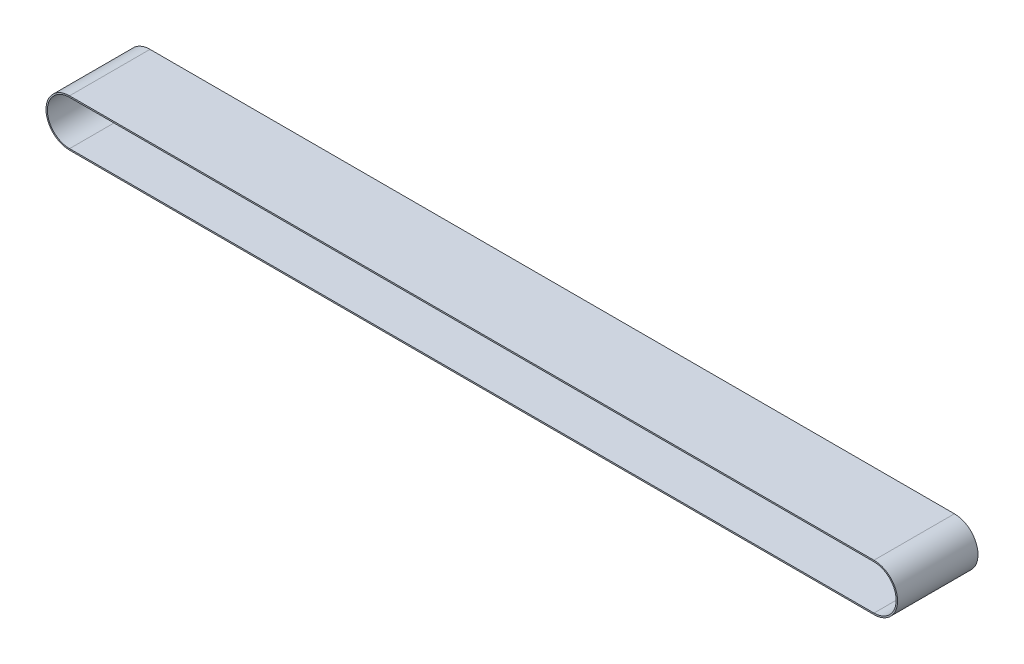
ISO-10303-21;
HEADER;
FILE_DESCRIPTION(('STEP AP214'),'2;1');
FILE_NAME('part.step','',(''),(''),'','','');
FILE_SCHEMA(('AUTOMOTIVE_DESIGN { 1 0 10303 214 1 1 1 1 }'));
ENDSEC;
DATA;
#1=APPLICATION_CONTEXT('core data for automotive mechanical design processes');
#2=APPLICATION_PROTOCOL_DEFINITION('international standard','automotive_design',2000,#1);
#3=PRODUCT_CONTEXT('',#1,'mechanical');
#4=PRODUCT('Part','Part','',(#3));
#5=PRODUCT_RELATED_PRODUCT_CATEGORY('part','',(#4));
#6=PRODUCT_DEFINITION_FORMATION('','',#4);
#7=PRODUCT_DEFINITION_CONTEXT('part definition',#1,'design');
#8=PRODUCT_DEFINITION('design','',#6,#7);
#9=PRODUCT_DEFINITION_SHAPE('','',#8);
#10=(LENGTH_UNIT() NAMED_UNIT(*) SI_UNIT(.MILLI.,.METRE.));
#11=(NAMED_UNIT(*) PLANE_ANGLE_UNIT() SI_UNIT($,.RADIAN.));
#12=(NAMED_UNIT(*) SI_UNIT($,.STERADIAN.) SOLID_ANGLE_UNIT());
#13=UNCERTAINTY_MEASURE_WITH_UNIT(LENGTH_MEASURE(1.E-05),#10,'distance_accuracy_value','');
#14=(GEOMETRIC_REPRESENTATION_CONTEXT(3) GLOBAL_UNCERTAINTY_ASSIGNED_CONTEXT((#13)) GLOBAL_UNIT_ASSIGNED_CONTEXT((#10,
#11,#12)) REPRESENTATION_CONTEXT('',''));
#15=CARTESIAN_POINT('',(0.,0.,0.));
#16=DIRECTION('',(0.,0.,1.));
#17=DIRECTION('',(1.,0.,0.));
#18=AXIS2_PLACEMENT_3D('',#15,#16,#17);
#19=CARTESIAN_POINT('',(0.,0.,58.));
#20=DIRECTION('',(0.,0.,1.));
#21=DIRECTION('',(1.,0.,0.));
#22=AXIS2_PLACEMENT_3D('',#19,#20,#21);
#23=PLANE('',#22);
#24=CARTESIAN_POINT('',(0.,0.,58.));
#25=DIRECTION('',(0.,0.,1.));
#26=DIRECTION('',(1.,0.,0.));
#27=AXIS2_PLACEMENT_3D('',#24,#25,#26);
#28=CIRCLE('',#27,17.);
#29=CARTESIAN_POINT('',(0.,17.,58.));
#30=VERTEX_POINT('',#29);
#31=CARTESIAN_POINT('',(0.,-17.,58.));
#32=VERTEX_POINT('',#31);
#33=EDGE_CURVE('E153',#30,#32,#28,.T.);
#34=ORIENTED_EDGE('',*,*,#33,.T.);
#35=DIRECTION('',(1.,0.,0.));
#36=VECTOR('',#35,1.);
#37=CARTESIAN_POINT('',(0.,-17.,58.));
#38=LINE('',#37,#36);
#39=CARTESIAN_POINT('',(580.,-17.,58.));
#40=VERTEX_POINT('',#39);
#41=EDGE_CURVE('E157',#32,#40,#38,.T.);
#42=ORIENTED_EDGE('',*,*,#41,.T.);
#43=CARTESIAN_POINT('',(580.,0.,58.));
#44=DIRECTION('',(0.,0.,1.));
#45=DIRECTION('',(1.,0.,0.));
#46=AXIS2_PLACEMENT_3D('',#43,#44,#45);
#47=CIRCLE('',#46,17.);
#48=CARTESIAN_POINT('',(580.,17.,58.));
#49=VERTEX_POINT('',#48);
#50=EDGE_CURVE('E161',#40,#49,#47,.T.);
#51=ORIENTED_EDGE('',*,*,#50,.T.);
#52=DIRECTION('',(-1.,0.,0.));
#53=VECTOR('',#52,1.);
#54=CARTESIAN_POINT('',(0.,17.,58.));
#55=LINE('',#54,#53);
#56=EDGE_CURVE('E164',#49,#30,#55,.T.);
#57=ORIENTED_EDGE('',*,*,#56,.T.);
#58=EDGE_LOOP('',(#34,#42,#51,#57));
#59=FACE_BOUND('',#58,.T.);
#60=DIRECTION('',(1.,0.,0.));
#61=VECTOR('',#60,1.);
#62=CARTESIAN_POINT('',(0.,-16.,58.));
#63=LINE('',#62,#61);
#64=CARTESIAN_POINT('',(0.,-16.,58.));
#65=VERTEX_POINT('',#64);
#66=CARTESIAN_POINT('',(580.,-16.,58.));
#67=VERTEX_POINT('',#66);
#68=EDGE_CURVE('E114',#65,#67,#63,.T.);
#69=ORIENTED_EDGE('',*,*,#68,.F.);
#70=CARTESIAN_POINT('',(0.,0.,58.));
#71=DIRECTION('',(0.,0.,1.));
#72=DIRECTION('',(1.,0.,0.));
#73=AXIS2_PLACEMENT_3D('',#70,#71,#72);
#74=CIRCLE('',#73,16.);
#75=CARTESIAN_POINT('',(0.,16.,58.));
#76=VERTEX_POINT('',#75);
#77=EDGE_CURVE('E105',#76,#65,#74,.T.);
#78=ORIENTED_EDGE('',*,*,#77,.F.);
#79=DIRECTION('',(-1.,0.,0.));
#80=VECTOR('',#79,1.);
#81=CARTESIAN_POINT('',(0.,16.,58.));
#82=LINE('',#81,#80);
#83=CARTESIAN_POINT('',(580.,16.,58.));
#84=VERTEX_POINT('',#83);
#85=EDGE_CURVE('E131',#84,#76,#82,.T.);
#86=ORIENTED_EDGE('',*,*,#85,.F.);
#87=CARTESIAN_POINT('',(580.,0.,58.));
#88=DIRECTION('',(0.,0.,1.));
#89=DIRECTION('',(1.,0.,0.));
#90=AXIS2_PLACEMENT_3D('',#87,#88,#89);
#91=CIRCLE('',#90,16.);
#92=EDGE_CURVE('E127',#67,#84,#91,.T.);
#93=ORIENTED_EDGE('',*,*,#92,.F.);
#94=EDGE_LOOP('',(#69,#78,#86,#93));
#95=FACE_BOUND('',#94,.T.);
#96=ADVANCED_FACE('F39',(#59,#95),#23,.T.);
#97=CARTESIAN_POINT('',(0.,0.,0.));
#98=DIRECTION('',(0.,0.,1.));
#99=DIRECTION('',(1.,0.,0.));
#100=AXIS2_PLACEMENT_3D('',#97,#98,#99);
#101=PLANE('',#100);
#102=CARTESIAN_POINT('',(0.,0.,0.));
#103=DIRECTION('',(0.,0.,1.));
#104=DIRECTION('',(1.,0.,0.));
#105=AXIS2_PLACEMENT_3D('',#102,#103,#104);
#106=CIRCLE('',#105,17.);
#107=CARTESIAN_POINT('',(0.,17.,0.));
#108=VERTEX_POINT('',#107);
#109=CARTESIAN_POINT('',(0.,-17.,0.));
#110=VERTEX_POINT('',#109);
#111=EDGE_CURVE('E123',#108,#110,#106,.T.);
#112=ORIENTED_EDGE('',*,*,#111,.F.);
#113=DIRECTION('',(-1.,0.,0.));
#114=VECTOR('',#113,1.);
#115=CARTESIAN_POINT('',(0.,17.,0.));
#116=LINE('',#115,#114);
#117=CARTESIAN_POINT('',(580.,17.,0.));
#118=VERTEX_POINT('',#117);
#119=EDGE_CURVE('E158',#118,#108,#116,.T.);
#120=ORIENTED_EDGE('',*,*,#119,.F.);
#121=CARTESIAN_POINT('',(580.,0.,0.));
#122=DIRECTION('',(0.,0.,1.));
#123=DIRECTION('',(1.,0.,0.));
#124=AXIS2_PLACEMENT_3D('',#121,#122,#123);
#125=CIRCLE('',#124,17.);
#126=CARTESIAN_POINT('',(580.,-17.,0.));
#127=VERTEX_POINT('',#126);
#128=EDGE_CURVE('E174',#127,#118,#125,.T.);
#129=ORIENTED_EDGE('',*,*,#128,.F.);
#130=DIRECTION('',(1.,0.,0.));
#131=VECTOR('',#130,1.);
#132=CARTESIAN_POINT('',(0.,-17.,0.));
#133=LINE('',#132,#131);
#134=EDGE_CURVE('E171',#110,#127,#133,.T.);
#135=ORIENTED_EDGE('',*,*,#134,.F.);
#136=EDGE_LOOP('',(#112,#120,#129,#135));
#137=FACE_BOUND('',#136,.T.);
#138=CARTESIAN_POINT('',(0.,0.,0.));
#139=DIRECTION('',(0.,0.,1.));
#140=DIRECTION('',(1.,0.,0.));
#141=AXIS2_PLACEMENT_3D('',#138,#139,#140);
#142=CIRCLE('',#141,16.);
#143=CARTESIAN_POINT('',(0.,16.,0.));
#144=VERTEX_POINT('',#143);
#145=CARTESIAN_POINT('',(0.,-16.,0.));
#146=VERTEX_POINT('',#145);
#147=EDGE_CURVE('E63',#144,#146,#142,.T.);
#148=ORIENTED_EDGE('',*,*,#147,.T.);
#149=DIRECTION('',(1.,0.,0.));
#150=VECTOR('',#149,1.);
#151=CARTESIAN_POINT('',(0.,-16.,0.));
#152=LINE('',#151,#150);
#153=CARTESIAN_POINT('',(580.,-16.,0.));
#154=VERTEX_POINT('',#153);
#155=EDGE_CURVE('E121',#146,#154,#152,.T.);
#156=ORIENTED_EDGE('',*,*,#155,.T.);
#157=CARTESIAN_POINT('',(580.,0.,0.));
#158=DIRECTION('',(0.,0.,1.));
#159=DIRECTION('',(1.,0.,0.));
#160=AXIS2_PLACEMENT_3D('',#157,#158,#159);
#161=CIRCLE('',#160,16.);
#162=CARTESIAN_POINT('',(580.,16.,0.));
#163=VERTEX_POINT('',#162);
#164=EDGE_CURVE('E140',#154,#163,#161,.T.);
#165=ORIENTED_EDGE('',*,*,#164,.T.);
#166=DIRECTION('',(-1.,0.,0.));
#167=VECTOR('',#166,1.);
#168=CARTESIAN_POINT('',(0.,16.,0.));
#169=LINE('',#168,#167);
#170=EDGE_CURVE('E115',#163,#144,#169,.T.);
#171=ORIENTED_EDGE('',*,*,#170,.T.);
#172=EDGE_LOOP('',(#148,#156,#165,#171));
#173=FACE_BOUND('',#172,.T.);
#174=ADVANCED_FACE('F197',(#137,#173),#101,.F.);
#175=CARTESIAN_POINT('',(0.,0.,58.));
#176=DIRECTION('',(0.,0.,-1.));
#177=DIRECTION('',(-1.,0.,0.));
#178=AXIS2_PLACEMENT_3D('',#175,#176,#177);
#179=CYLINDRICAL_SURFACE('',#178,17.);
#180=ORIENTED_EDGE('',*,*,#111,.T.);
#181=DIRECTION('',(0.,0.,-1.));
#182=VECTOR('',#181,1.);
#183=CARTESIAN_POINT('',(0.,-17.,58.));
#184=LINE('',#183,#182);
#185=EDGE_CURVE('E11',#32,#110,#184,.T.);
#186=ORIENTED_EDGE('',*,*,#185,.F.);
#187=ORIENTED_EDGE('',*,*,#33,.F.);
#188=DIRECTION('',(0.,0.,-1.));
#189=VECTOR('',#188,1.);
#190=CARTESIAN_POINT('',(0.,17.,58.));
#191=LINE('',#190,#189);
#192=EDGE_CURVE('E167',#30,#108,#191,.T.);
#193=ORIENTED_EDGE('',*,*,#192,.T.);
#194=EDGE_LOOP('',(#180,#186,#187,#193));
#195=FACE_BOUND('',#194,.T.);
#196=ADVANCED_FACE('F41',(#195),#179,.T.);
#197=CARTESIAN_POINT('',(0.,-17.,58.));
#198=DIRECTION('',(0.,1.,0.));
#199=DIRECTION('',(0.,0.,1.));
#200=AXIS2_PLACEMENT_3D('',#197,#198,#199);
#201=PLANE('',#200);
#202=ORIENTED_EDGE('',*,*,#134,.T.);
#203=DIRECTION('',(0.,0.,-1.));
#204=VECTOR('',#203,1.);
#205=CARTESIAN_POINT('',(580.,-17.,58.));
#206=LINE('',#205,#204);
#207=EDGE_CURVE('E48',#40,#127,#206,.T.);
#208=ORIENTED_EDGE('',*,*,#207,.F.);
#209=ORIENTED_EDGE('',*,*,#41,.F.);
#210=ORIENTED_EDGE('',*,*,#185,.T.);
#211=EDGE_LOOP('',(#202,#208,#209,#210));
#212=FACE_BOUND('',#211,.T.);
#213=ADVANCED_FACE('F207',(#212),#201,.F.);
#214=CARTESIAN_POINT('',(580.,0.,58.));
#215=DIRECTION('',(0.,0.,-1.));
#216=DIRECTION('',(-1.,0.,0.));
#217=AXIS2_PLACEMENT_3D('',#214,#215,#216);
#218=CYLINDRICAL_SURFACE('',#217,17.);
#219=ORIENTED_EDGE('',*,*,#128,.T.);
#220=DIRECTION('',(0.,0.,-1.));
#221=VECTOR('',#220,1.);
#222=CARTESIAN_POINT('',(580.,17.,58.));
#223=LINE('',#222,#221);
#224=EDGE_CURVE('E182',#49,#118,#223,.T.);
#225=ORIENTED_EDGE('',*,*,#224,.F.);
#226=ORIENTED_EDGE('',*,*,#50,.F.);
#227=ORIENTED_EDGE('',*,*,#207,.T.);
#228=EDGE_LOOP('',(#219,#225,#226,#227));
#229=FACE_BOUND('',#228,.T.);
#230=ADVANCED_FACE('F191',(#229),#218,.T.);
#231=CARTESIAN_POINT('',(0.,17.,58.));
#232=DIRECTION('',(0.,-1.,0.));
#233=DIRECTION('',(0.,0.,-1.));
#234=AXIS2_PLACEMENT_3D('',#231,#232,#233);
#235=PLANE('',#234);
#236=ORIENTED_EDGE('',*,*,#119,.T.);
#237=ORIENTED_EDGE('',*,*,#192,.F.);
#238=ORIENTED_EDGE('',*,*,#56,.F.);
#239=ORIENTED_EDGE('',*,*,#224,.T.);
#240=EDGE_LOOP('',(#236,#237,#238,#239));
#241=FACE_BOUND('',#240,.T.);
#242=ADVANCED_FACE('F201',(#241),#235,.F.);
#243=CARTESIAN_POINT('',(0.,0.,58.));
#244=DIRECTION('',(0.,0.,-1.));
#245=DIRECTION('',(-1.,0.,0.));
#246=AXIS2_PLACEMENT_3D('',#243,#244,#245);
#247=CYLINDRICAL_SURFACE('',#246,16.);
#248=ORIENTED_EDGE('',*,*,#147,.F.);
#249=DIRECTION('',(0.,0.,-1.));
#250=VECTOR('',#249,1.);
#251=CARTESIAN_POINT('',(0.,16.,58.));
#252=LINE('',#251,#250);
#253=EDGE_CURVE('E109',#76,#144,#252,.T.);
#254=ORIENTED_EDGE('',*,*,#253,.F.);
#255=ORIENTED_EDGE('',*,*,#77,.T.);
#256=DIRECTION('',(0.,0.,-1.));
#257=VECTOR('',#256,1.);
#258=CARTESIAN_POINT('',(0.,-16.,58.));
#259=LINE('',#258,#257);
#260=EDGE_CURVE('E108',#65,#146,#259,.T.);
#261=ORIENTED_EDGE('',*,*,#260,.T.);
#262=EDGE_LOOP('',(#248,#254,#255,#261));
#263=FACE_BOUND('',#262,.T.);
#264=ADVANCED_FACE('F107',(#263),#247,.F.);
#265=CARTESIAN_POINT('',(0.,-16.,58.));
#266=DIRECTION('',(0.,1.,0.));
#267=DIRECTION('',(0.,0.,1.));
#268=AXIS2_PLACEMENT_3D('',#265,#266,#267);
#269=PLANE('',#268);
#270=ORIENTED_EDGE('',*,*,#155,.F.);
#271=ORIENTED_EDGE('',*,*,#260,.F.);
#272=ORIENTED_EDGE('',*,*,#68,.T.);
#273=DIRECTION('',(0.,0.,-1.));
#274=VECTOR('',#273,1.);
#275=CARTESIAN_POINT('',(580.,-16.,58.));
#276=LINE('',#275,#274);
#277=EDGE_CURVE('E124',#67,#154,#276,.T.);
#278=ORIENTED_EDGE('',*,*,#277,.T.);
#279=EDGE_LOOP('',(#270,#271,#272,#278));
#280=FACE_BOUND('',#279,.T.);
#281=ADVANCED_FACE('F118',(#280),#269,.T.);
#282=CARTESIAN_POINT('',(580.,0.,58.));
#283=DIRECTION('',(0.,0.,-1.));
#284=DIRECTION('',(-1.,0.,0.));
#285=AXIS2_PLACEMENT_3D('',#282,#283,#284);
#286=CYLINDRICAL_SURFACE('',#285,16.);
#287=ORIENTED_EDGE('',*,*,#164,.F.);
#288=ORIENTED_EDGE('',*,*,#277,.F.);
#289=ORIENTED_EDGE('',*,*,#92,.T.);
#290=DIRECTION('',(0.,0.,-1.));
#291=VECTOR('',#290,1.);
#292=CARTESIAN_POINT('',(580.,16.,58.));
#293=LINE('',#292,#291);
#294=EDGE_CURVE('E55',#84,#163,#293,.T.);
#295=ORIENTED_EDGE('',*,*,#294,.T.);
#296=EDGE_LOOP('',(#287,#288,#289,#295));
#297=FACE_BOUND('',#296,.T.);
#298=ADVANCED_FACE('F230',(#297),#286,.F.);
#299=CARTESIAN_POINT('',(0.,16.,58.));
#300=DIRECTION('',(0.,-1.,0.));
#301=DIRECTION('',(0.,0.,-1.));
#302=AXIS2_PLACEMENT_3D('',#299,#300,#301);
#303=PLANE('',#302);
#304=ORIENTED_EDGE('',*,*,#170,.F.);
#305=ORIENTED_EDGE('',*,*,#294,.F.);
#306=ORIENTED_EDGE('',*,*,#85,.T.);
#307=ORIENTED_EDGE('',*,*,#253,.T.);
#308=EDGE_LOOP('',(#304,#305,#306,#307));
#309=FACE_BOUND('',#308,.T.);
#310=ADVANCED_FACE('F234',(#309),#303,.T.);
#311=CLOSED_SHELL('',(#96,#174,#196,#213,#230,#242,#264,#281,#298,#310));
#312=MANIFOLD_SOLID_BREP('B2',#311);
#313=ADVANCED_BREP_SHAPE_REPRESENTATION('',(#18,#312),#14);
#314=SHAPE_DEFINITION_REPRESENTATION(#9,#313);
ENDSEC;
END-ISO-10303-21;
